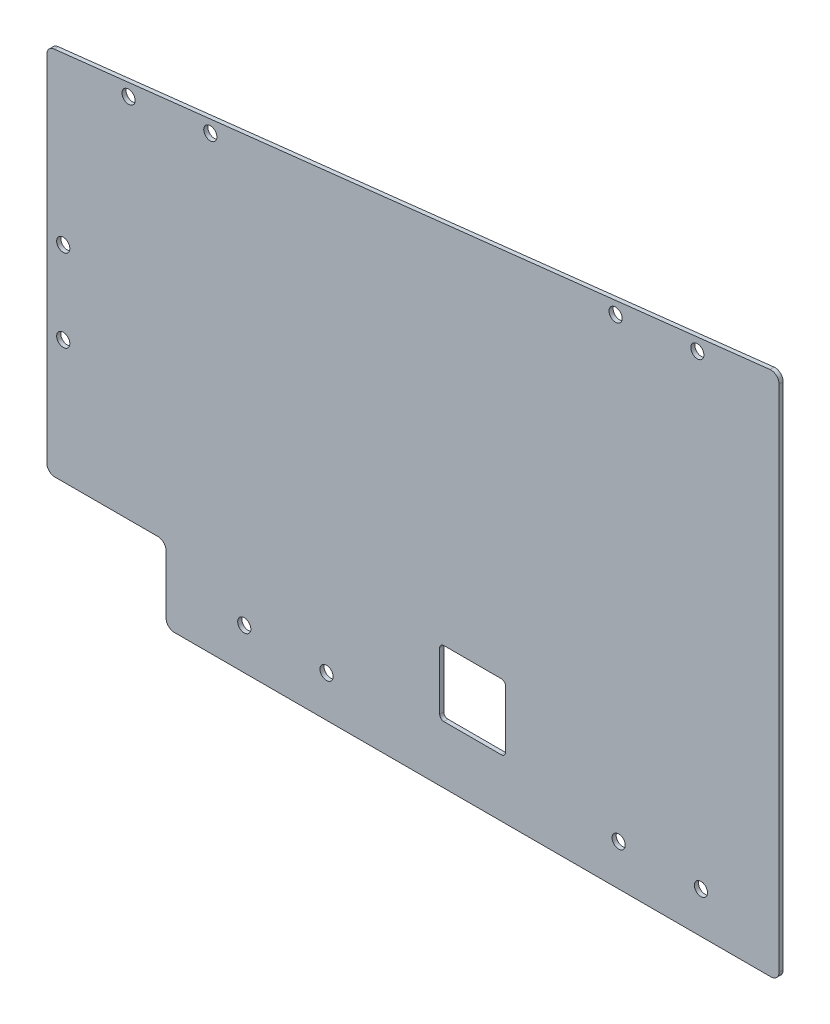
ISO-10303-21;
HEADER;
FILE_DESCRIPTION(('STEP AP214'),'2;1');
FILE_NAME('part.step','',(''),(''),'','','');
FILE_SCHEMA(('AUTOMOTIVE_DESIGN { 1 0 10303 214 1 1 1 1 }'));
ENDSEC;
DATA;
#1=APPLICATION_CONTEXT('core data for automotive mechanical design processes');
#2=APPLICATION_PROTOCOL_DEFINITION('international standard','automotive_design',2000,#1);
#3=PRODUCT_CONTEXT('',#1,'mechanical');
#4=PRODUCT('Part','Part','',(#3));
#5=PRODUCT_RELATED_PRODUCT_CATEGORY('part','',(#4));
#6=PRODUCT_DEFINITION_FORMATION('','',#4);
#7=PRODUCT_DEFINITION_CONTEXT('part definition',#1,'design');
#8=PRODUCT_DEFINITION('design','',#6,#7);
#9=PRODUCT_DEFINITION_SHAPE('','',#8);
#10=(LENGTH_UNIT() NAMED_UNIT(*) SI_UNIT(.MILLI.,.METRE.));
#11=(NAMED_UNIT(*) PLANE_ANGLE_UNIT() SI_UNIT($,.RADIAN.));
#12=(NAMED_UNIT(*) SI_UNIT($,.STERADIAN.) SOLID_ANGLE_UNIT());
#13=UNCERTAINTY_MEASURE_WITH_UNIT(LENGTH_MEASURE(1.E-05),#10,'distance_accuracy_value','');
#14=(GEOMETRIC_REPRESENTATION_CONTEXT(3) GLOBAL_UNCERTAINTY_ASSIGNED_CONTEXT((#13)) GLOBAL_UNIT_ASSIGNED_CONTEXT((#10,
#11,#12)) REPRESENTATION_CONTEXT('',''));
#15=CARTESIAN_POINT('',(0.,0.,0.));
#16=DIRECTION('',(0.,0.,1.));
#17=DIRECTION('',(1.,0.,0.));
#18=AXIS2_PLACEMENT_3D('',#15,#16,#17);
#19=CARTESIAN_POINT('',(-45.,-10.,1.));
#20=DIRECTION('',(0.,1.,0.));
#21=DIRECTION('',(0.,0.,1.));
#22=AXIS2_PLACEMENT_3D('',#19,#20,#21);
#23=PLANE('',#22);
#24=DIRECTION('',(1.,0.,0.));
#25=VECTOR('',#24,1.);
#26=CARTESIAN_POINT('',(-45.,-10.,0.));
#27=LINE('',#26,#25);
#28=CARTESIAN_POINT('',(-83.,-10.,0.));
#29=VERTEX_POINT('',#28);
#30=CARTESIAN_POINT('',(62.,-10.,0.));
#31=VERTEX_POINT('',#30);
#32=EDGE_CURVE('E178',#29,#31,#27,.T.);
#33=ORIENTED_EDGE('',*,*,#32,.T.);
#34=DIRECTION('',(0.,0.,1.));
#35=VECTOR('',#34,1.);
#36=CARTESIAN_POINT('',(62.,-10.,1.));
#37=LINE('',#36,#35);
#38=CARTESIAN_POINT('',(62.,-10.,1.));
#39=VERTEX_POINT('',#38);
#40=EDGE_CURVE('E184',#31,#39,#37,.T.);
#41=ORIENTED_EDGE('',*,*,#40,.T.);
#42=DIRECTION('',(1.,0.,0.));
#43=VECTOR('',#42,1.);
#44=CARTESIAN_POINT('',(-45.,-10.,1.));
#45=LINE('',#44,#43);
#46=CARTESIAN_POINT('',(-83.,-10.,1.));
#47=VERTEX_POINT('',#46);
#48=EDGE_CURVE('E181',#47,#39,#45,.T.);
#49=ORIENTED_EDGE('',*,*,#48,.F.);
#50=DIRECTION('',(0.,0.,1.));
#51=VECTOR('',#50,1.);
#52=CARTESIAN_POINT('',(-83.,-10.,0.));
#53=LINE('',#52,#51);
#54=EDGE_CURVE('E175',#47,#29,#53,.F.);
#55=ORIENTED_EDGE('',*,*,#54,.T.);
#56=EDGE_LOOP('',(#33,#41,#49,#55));
#57=FACE_BOUND('',#56,.T.);
#58=ADVANCED_FACE('F37',(#57),#23,.F.);
#59=CARTESIAN_POINT('',(0.,0.,1.));
#60=DIRECTION('',(0.,0.,-1.));
#61=DIRECTION('',(-1.,0.,0.));
#62=AXIS2_PLACEMENT_3D('',#59,#60,#61);
#63=PLANE('',#62);
#64=DIRECTION('',(-1.,0.,0.));
#65=VECTOR('',#64,1.);
#66=CARTESIAN_POINT('',(-18.5,20.,1.));
#67=LINE('',#66,#65);
#68=CARTESIAN_POINT('',(-3.50000000000002,20.,1.));
#69=VERTEX_POINT('',#68);
#70=CARTESIAN_POINT('',(-17.5,20.,1.));
#71=VERTEX_POINT('',#70);
#72=EDGE_CURVE('E304',#69,#71,#67,.T.);
#73=ORIENTED_EDGE('',*,*,#72,.F.);
#74=CARTESIAN_POINT('',(-3.50000000000002,19.,1.));
#75=DIRECTION('',(0.,0.,-1.));
#76=DIRECTION('',(-1.,0.,0.));
#77=AXIS2_PLACEMENT_3D('',#74,#75,#76);
#78=CIRCLE('',#77,1.);
#79=CARTESIAN_POINT('',(-2.50000000000002,19.,1.));
#80=VERTEX_POINT('',#79);
#81=EDGE_CURVE('E52',#69,#80,#78,.T.);
#82=ORIENTED_EDGE('',*,*,#81,.T.);
#83=DIRECTION('',(0.,1.,0.));
#84=VECTOR('',#83,1.);
#85=CARTESIAN_POINT('',(-2.50000000000002,4.,1.));
#86=LINE('',#85,#84);
#87=CARTESIAN_POINT('',(-2.50000000000002,5.,1.));
#88=VERTEX_POINT('',#87);
#89=EDGE_CURVE('E279',#88,#80,#86,.T.);
#90=ORIENTED_EDGE('',*,*,#89,.F.);
#91=CARTESIAN_POINT('',(-3.50000000000002,5.,1.));
#92=DIRECTION('',(0.,0.,-1.));
#93=DIRECTION('',(-1.,0.,0.));
#94=AXIS2_PLACEMENT_3D('',#91,#92,#93);
#95=CIRCLE('',#94,1.);
#96=CARTESIAN_POINT('',(-3.50000000000002,4.,1.));
#97=VERTEX_POINT('',#96);
#98=EDGE_CURVE('E45',#88,#97,#95,.T.);
#99=ORIENTED_EDGE('',*,*,#98,.T.);
#100=DIRECTION('',(1.,0.,0.));
#101=VECTOR('',#100,1.);
#102=CARTESIAN_POINT('',(-18.5,4.,1.));
#103=LINE('',#102,#101);
#104=CARTESIAN_POINT('',(-17.5,4.,1.));
#105=VERTEX_POINT('',#104);
#106=EDGE_CURVE('E278',#105,#97,#103,.T.);
#107=ORIENTED_EDGE('',*,*,#106,.F.);
#108=CARTESIAN_POINT('',(-17.5,5.,1.));
#109=DIRECTION('',(0.,0.,-1.));
#110=DIRECTION('',(-1.,0.,0.));
#111=AXIS2_PLACEMENT_3D('',#108,#109,#110);
#112=CIRCLE('',#111,1.);
#113=CARTESIAN_POINT('',(-18.5,5.,1.));
#114=VERTEX_POINT('',#113);
#115=EDGE_CURVE('E264',#105,#114,#112,.T.);
#116=ORIENTED_EDGE('',*,*,#115,.T.);
#117=DIRECTION('',(0.,-1.,0.));
#118=VECTOR('',#117,1.);
#119=CARTESIAN_POINT('',(-18.5,4.,1.));
#120=LINE('',#119,#118);
#121=CARTESIAN_POINT('',(-18.5,19.,1.));
#122=VERTEX_POINT('',#121);
#123=EDGE_CURVE('E285',#122,#114,#120,.T.);
#124=ORIENTED_EDGE('',*,*,#123,.F.);
#125=CARTESIAN_POINT('',(-17.5,19.,1.));
#126=DIRECTION('',(0.,0.,-1.));
#127=DIRECTION('',(-1.,0.,0.));
#128=AXIS2_PLACEMENT_3D('',#125,#126,#127);
#129=CIRCLE('',#128,1.);
#130=EDGE_CURVE('E268',#122,#71,#129,.T.);
#131=ORIENTED_EDGE('',*,*,#130,.T.);
#132=EDGE_LOOP('',(#73,#82,#90,#99,#107,#116,#124,#131));
#133=FACE_BOUND('',#132,.T.);
#134=CARTESIAN_POINT('',(-110.,58.1,0.999999999999999));
#135=DIRECTION('',(0.,0.,-1.));
#136=DIRECTION('',(-1.,0.,0.));
#137=AXIS2_PLACEMENT_3D('',#134,#135,#136);
#138=CIRCLE('',#137,1.60000000000001);
#139=CARTESIAN_POINT('',(-111.6,58.1,0.999999999999999));
#140=VERTEX_POINT('',#139);
#141=EDGE_CURVE('E329',#140,#140,#138,.T.);
#142=ORIENTED_EDGE('',*,*,#141,.T.);
#143=EDGE_LOOP('',(#142));
#144=FACE_BOUND('',#143,.T.);
#145=CARTESIAN_POINT('',(-110.,38.1,0.999999999999999));
#146=DIRECTION('',(0.,0.,-1.));
#147=DIRECTION('',(-1.,0.,0.));
#148=AXIS2_PLACEMENT_3D('',#145,#146,#147);
#149=CIRCLE('',#148,1.60000000000001);
#150=CARTESIAN_POINT('',(-111.6,38.1,0.999999999999999));
#151=VERTEX_POINT('',#150);
#152=EDGE_CURVE('E324',#151,#151,#149,.T.);
#153=ORIENTED_EDGE('',*,*,#152,.T.);
#154=EDGE_LOOP('',(#153));
#155=FACE_BOUND('',#154,.T.);
#156=CARTESIAN_POINT('',(-94.1250637576601,97.2142612947495,1.));
#157=DIRECTION('',(0.,0.,1.));
#158=DIRECTION('',(1.,0.,0.));
#159=AXIS2_PLACEMENT_3D('',#156,#157,#158);
#160=CIRCLE('',#159,1.60000000000001);
#161=CARTESIAN_POINT('',(-92.52506375766,97.2142612947495,1.));
#162=VERTEX_POINT('',#161);
#163=EDGE_CURVE('E333',#162,#162,#160,.T.);
#164=ORIENTED_EDGE('',*,*,#163,.F.);
#165=EDGE_LOOP('',(#164));
#166=FACE_BOUND('',#165,.T.);
#167=CARTESIAN_POINT('',(-74.2501275153201,99.4474001983832,1.));
#168=DIRECTION('',(0.,0.,1.));
#169=DIRECTION('',(1.,0.,0.));
#170=AXIS2_PLACEMENT_3D('',#167,#168,#169);
#171=CIRCLE('',#170,1.60000000000001);
#172=CARTESIAN_POINT('',(-72.6501275153201,99.4474001983832,1.));
#173=VERTEX_POINT('',#172);
#174=EDGE_CURVE('E337',#173,#173,#171,.T.);
#175=ORIENTED_EDGE('',*,*,#174,.F.);
#176=EDGE_LOOP('',(#175));
#177=FACE_BOUND('',#176,.T.);
#178=CARTESIAN_POINT('',(24.2501275153201,110.514844583848,1.));
#179=DIRECTION('',(0.,0.,1.));
#180=DIRECTION('',(1.,0.,0.));
#181=AXIS2_PLACEMENT_3D('',#178,#179,#180);
#182=CIRCLE('',#181,1.60000000000001);
#183=CARTESIAN_POINT('',(25.8501275153201,110.514844583848,1.));
#184=VERTEX_POINT('',#183);
#185=EDGE_CURVE('E340',#184,#184,#182,.T.);
#186=ORIENTED_EDGE('',*,*,#185,.F.);
#187=EDGE_LOOP('',(#186));
#188=FACE_BOUND('',#187,.T.);
#189=CARTESIAN_POINT('',(44.12506375766,112.747983487482,1.));
#190=DIRECTION('',(0.,0.,1.));
#191=DIRECTION('',(1.,0.,0.));
#192=AXIS2_PLACEMENT_3D('',#189,#190,#191);
#193=CIRCLE('',#192,1.60000000000001);
#194=CARTESIAN_POINT('',(45.7250637576601,112.747983487482,1.));
#195=VERTEX_POINT('',#194);
#196=EDGE_CURVE('E332',#195,#195,#193,.T.);
#197=ORIENTED_EDGE('',*,*,#196,.F.);
#198=EDGE_LOOP('',(#197));
#199=FACE_BOUND('',#198,.T.);
#200=CARTESIAN_POINT('',(45.,0.,1.));
#201=DIRECTION('',(0.,0.,1.));
#202=DIRECTION('',(1.,0.,0.));
#203=AXIS2_PLACEMENT_3D('',#200,#201,#202);
#204=CIRCLE('',#203,1.6);
#205=CARTESIAN_POINT('',(46.6,0.,1.));
#206=VERTEX_POINT('',#205);
#207=EDGE_CURVE('E345',#206,#206,#204,.T.);
#208=ORIENTED_EDGE('',*,*,#207,.F.);
#209=EDGE_LOOP('',(#208));
#210=FACE_BOUND('',#209,.T.);
#211=CARTESIAN_POINT('',(-46.,0.,1.));
#212=DIRECTION('',(0.,0.,1.));
#213=DIRECTION('',(1.,0.,0.));
#214=AXIS2_PLACEMENT_3D('',#211,#212,#213);
#215=CIRCLE('',#214,1.6);
#216=CARTESIAN_POINT('',(-44.4,0.,1.));
#217=VERTEX_POINT('',#216);
#218=EDGE_CURVE('E350',#217,#217,#215,.T.);
#219=ORIENTED_EDGE('',*,*,#218,.F.);
#220=EDGE_LOOP('',(#219));
#221=FACE_BOUND('',#220,.T.);
#222=CARTESIAN_POINT('',(-66.,0.,1.));
#223=DIRECTION('',(0.,0.,1.));
#224=DIRECTION('',(1.,0.,0.));
#225=AXIS2_PLACEMENT_3D('',#222,#223,#224);
#226=CIRCLE('',#225,1.60000000000001);
#227=CARTESIAN_POINT('',(-64.4,0.,1.));
#228=VERTEX_POINT('',#227);
#229=EDGE_CURVE('E353',#228,#228,#226,.T.);
#230=ORIENTED_EDGE('',*,*,#229,.F.);
#231=EDGE_LOOP('',(#230));
#232=FACE_BOUND('',#231,.T.);
#233=CARTESIAN_POINT('',(25.,0.,1.));
#234=DIRECTION('',(0.,0.,1.));
#235=DIRECTION('',(1.,0.,0.));
#236=AXIS2_PLACEMENT_3D('',#233,#234,#235);
#237=CIRCLE('',#236,1.6);
#238=CARTESIAN_POINT('',(26.6,0.,1.));
#239=VERTEX_POINT('',#238);
#240=EDGE_CURVE('E349',#239,#239,#237,.T.);
#241=ORIENTED_EDGE('',*,*,#240,.F.);
#242=EDGE_LOOP('',(#241));
#243=FACE_BOUND('',#242,.T.);
#244=ORIENTED_EDGE('',*,*,#48,.T.);
#245=CARTESIAN_POINT('',(62.,-8.,1.));
#246=DIRECTION('',(0.,0.,-1.));
#247=DIRECTION('',(-1.,0.,0.));
#248=AXIS2_PLACEMENT_3D('',#245,#246,#247);
#249=CIRCLE('',#248,2.);
#250=CARTESIAN_POINT('',(64.,-8.,1.));
#251=VERTEX_POINT('',#250);
#252=EDGE_CURVE('E417',#39,#251,#249,.F.);
#253=ORIENTED_EDGE('',*,*,#252,.T.);
#254=DIRECTION('',(0.,-1.,0.));
#255=VECTOR('',#254,1.);
#256=CARTESIAN_POINT('',(64.,0.,1.));
#257=LINE('',#256,#255);
#258=CARTESIAN_POINT('',(64.,115.762695826287,1.));
#259=VERTEX_POINT('',#258);
#260=EDGE_CURVE('E382',#259,#251,#257,.T.);
#261=ORIENTED_EDGE('',*,*,#260,.F.);
#262=CARTESIAN_POINT('',(62.,115.762695826287,1.));
#263=DIRECTION('',(0.,0.,-1.));
#264=DIRECTION('',(-1.,0.,0.));
#265=AXIS2_PLACEMENT_3D('',#262,#263,#264);
#266=CIRCLE('',#265,2.);
#267=CARTESIAN_POINT('',(61.7766861096366,117.750189450521,1.));
#268=VERTEX_POINT('',#267);
#269=EDGE_CURVE('E415',#259,#268,#266,.F.);
#270=ORIENTED_EDGE('',*,*,#269,.T.);
#271=DIRECTION('',(0.993746812116997,0.111656945181685,0.));
#272=VECTOR('',#271,1.);
#273=CARTESIAN_POINT('',(-12.295225034285,109.427502805137,1.));
#274=LINE('',#273,#272);
#275=CARTESIAN_POINT('',(-112.223313890363,98.1996276527682,1.));
#276=VERTEX_POINT('',#275);
#277=EDGE_CURVE('E363',#276,#268,#274,.T.);
#278=ORIENTED_EDGE('',*,*,#277,.F.);
#279=CARTESIAN_POINT('',(-112.,96.2121340285342,1.));
#280=DIRECTION('',(0.,0.,-1.));
#281=DIRECTION('',(-1.,0.,0.));
#282=AXIS2_PLACEMENT_3D('',#279,#280,#281);
#283=CIRCLE('',#282,2.);
#284=CARTESIAN_POINT('',(-114.,96.2121340285342,1.));
#285=VERTEX_POINT('',#284);
#286=EDGE_CURVE('E413',#276,#285,#283,.F.);
#287=ORIENTED_EDGE('',*,*,#286,.T.);
#288=DIRECTION('',(0.,1.,0.));
#289=VECTOR('',#288,1.);
#290=CARTESIAN_POINT('',(-114.,0.,1.));
#291=LINE('',#290,#289);
#292=CARTESIAN_POINT('',(-114.,10.2,1.));
#293=VERTEX_POINT('',#292);
#294=EDGE_CURVE('E372',#293,#285,#291,.T.);
#295=ORIENTED_EDGE('',*,*,#294,.F.);
#296=CARTESIAN_POINT('',(-112.,10.2,1.));
#297=DIRECTION('',(0.,0.,-1.));
#298=DIRECTION('',(-1.,0.,0.));
#299=AXIS2_PLACEMENT_3D('',#296,#297,#298);
#300=CIRCLE('',#299,2.);
#301=CARTESIAN_POINT('',(-112.,8.2,1.));
#302=VERTEX_POINT('',#301);
#303=EDGE_CURVE('E409',#293,#302,#300,.F.);
#304=ORIENTED_EDGE('',*,*,#303,.T.);
#305=DIRECTION('',(-1.,0.,0.));
#306=VECTOR('',#305,1.);
#307=CARTESIAN_POINT('',(0.,8.20000000000001,1.));
#308=LINE('',#307,#306);
#309=CARTESIAN_POINT('',(-87.,8.2,1.));
#310=VERTEX_POINT('',#309);
#311=EDGE_CURVE('E375',#310,#302,#308,.T.);
#312=ORIENTED_EDGE('',*,*,#311,.F.);
#313=CARTESIAN_POINT('',(-87.,6.2,1.));
#314=DIRECTION('',(0.,0.,-1.));
#315=DIRECTION('',(-1.,0.,0.));
#316=AXIS2_PLACEMENT_3D('',#313,#314,#315);
#317=CIRCLE('',#316,2.);
#318=CARTESIAN_POINT('',(-85.,6.2,1.));
#319=VERTEX_POINT('',#318);
#320=EDGE_CURVE('E229',#310,#319,#317,.T.);
#321=ORIENTED_EDGE('',*,*,#320,.T.);
#322=DIRECTION('',(0.,-1.,0.));
#323=VECTOR('',#322,1.);
#324=CARTESIAN_POINT('',(-85.,0.,1.));
#325=LINE('',#324,#323);
#326=CARTESIAN_POINT('',(-85.,-8.,1.));
#327=VERTEX_POINT('',#326);
#328=EDGE_CURVE('E379',#319,#327,#325,.T.);
#329=ORIENTED_EDGE('',*,*,#328,.T.);
#330=CARTESIAN_POINT('',(-83.,-8.,1.));
#331=DIRECTION('',(0.,0.,-1.));
#332=DIRECTION('',(-1.,0.,0.));
#333=AXIS2_PLACEMENT_3D('',#330,#331,#332);
#334=CIRCLE('',#333,2.);
#335=EDGE_CURVE('E411',#327,#47,#334,.F.);
#336=ORIENTED_EDGE('',*,*,#335,.T.);
#337=EDGE_LOOP('',(#244,#253,#261,#270,#278,#287,#295,#304,#312,#321,#329,#336));
#338=FACE_BOUND('',#337,.T.);
#339=ADVANCED_FACE('F276',(#133,#144,#155,#166,#177,#188,#199,#210,#221,#232,#243,#338),#63,.F.);
#340=CARTESIAN_POINT('',(0.,0.,0.));
#341=DIRECTION('',(0.,0.,-1.));
#342=DIRECTION('',(-1.,0.,0.));
#343=AXIS2_PLACEMENT_3D('',#340,#341,#342);
#344=PLANE('',#343);
#345=DIRECTION('',(0.,-1.,0.));
#346=VECTOR('',#345,1.);
#347=CARTESIAN_POINT('',(-2.50000000000002,0.,0.));
#348=LINE('',#347,#346);
#349=CARTESIAN_POINT('',(-2.50000000000002,19.,0.));
#350=VERTEX_POINT('',#349);
#351=CARTESIAN_POINT('',(-2.50000000000002,5.,0.));
#352=VERTEX_POINT('',#351);
#353=EDGE_CURVE('E242',#350,#352,#348,.T.);
#354=ORIENTED_EDGE('',*,*,#353,.F.);
#355=CARTESIAN_POINT('',(-3.50000000000002,19.,0.));
#356=DIRECTION('',(0.,0.,-1.));
#357=DIRECTION('',(-1.,0.,0.));
#358=AXIS2_PLACEMENT_3D('',#355,#356,#357);
#359=CIRCLE('',#358,1.);
#360=CARTESIAN_POINT('',(-3.50000000000002,20.,0.));
#361=VERTEX_POINT('',#360);
#362=EDGE_CURVE('E273',#350,#361,#359,.F.);
#363=ORIENTED_EDGE('',*,*,#362,.T.);
#364=DIRECTION('',(1.,0.,0.));
#365=VECTOR('',#364,1.);
#366=CARTESIAN_POINT('',(0.,20.,0.));
#367=LINE('',#366,#365);
#368=CARTESIAN_POINT('',(-17.5,20.,0.));
#369=VERTEX_POINT('',#368);
#370=EDGE_CURVE('E233',#369,#361,#367,.T.);
#371=ORIENTED_EDGE('',*,*,#370,.F.);
#372=CARTESIAN_POINT('',(-17.5,19.,0.));
#373=DIRECTION('',(0.,0.,-1.));
#374=DIRECTION('',(-1.,0.,0.));
#375=AXIS2_PLACEMENT_3D('',#372,#373,#374);
#376=CIRCLE('',#375,1.);
#377=CARTESIAN_POINT('',(-18.5,19.,0.));
#378=VERTEX_POINT('',#377);
#379=EDGE_CURVE('E270',#369,#378,#376,.F.);
#380=ORIENTED_EDGE('',*,*,#379,.T.);
#381=DIRECTION('',(0.,1.,0.));
#382=VECTOR('',#381,1.);
#383=CARTESIAN_POINT('',(-18.5,0.,0.));
#384=LINE('',#383,#382);
#385=CARTESIAN_POINT('',(-18.5,5.,0.));
#386=VERTEX_POINT('',#385);
#387=EDGE_CURVE('E236',#386,#378,#384,.T.);
#388=ORIENTED_EDGE('',*,*,#387,.F.);
#389=CARTESIAN_POINT('',(-17.5,5.,0.));
#390=DIRECTION('',(0.,0.,-1.));
#391=DIRECTION('',(-1.,0.,0.));
#392=AXIS2_PLACEMENT_3D('',#389,#390,#391);
#393=CIRCLE('',#392,1.);
#394=CARTESIAN_POINT('',(-17.5,4.,0.));
#395=VERTEX_POINT('',#394);
#396=EDGE_CURVE('E266',#386,#395,#393,.F.);
#397=ORIENTED_EDGE('',*,*,#396,.T.);
#398=DIRECTION('',(-1.,0.,0.));
#399=VECTOR('',#398,1.);
#400=CARTESIAN_POINT('',(0.,4.,0.));
#401=LINE('',#400,#399);
#402=CARTESIAN_POINT('',(-3.50000000000002,4.,0.));
#403=VERTEX_POINT('',#402);
#404=EDGE_CURVE('E239',#403,#395,#401,.T.);
#405=ORIENTED_EDGE('',*,*,#404,.F.);
#406=CARTESIAN_POINT('',(-3.50000000000002,5.,0.));
#407=DIRECTION('',(0.,0.,-1.));
#408=DIRECTION('',(-1.,0.,0.));
#409=AXIS2_PLACEMENT_3D('',#406,#407,#408);
#410=CIRCLE('',#409,1.);
#411=EDGE_CURVE('E11',#403,#352,#410,.F.);
#412=ORIENTED_EDGE('',*,*,#411,.T.);
#413=EDGE_LOOP('',(#354,#363,#371,#380,#388,#397,#405,#412));
#414=FACE_BOUND('',#413,.T.);
#415=CARTESIAN_POINT('',(-110.,58.1,0.));
#416=DIRECTION('',(0.,0.,-1.));
#417=DIRECTION('',(-1.,0.,0.));
#418=AXIS2_PLACEMENT_3D('',#415,#416,#417);
#419=CIRCLE('',#418,1.60000000000001);
#420=CARTESIAN_POINT('',(-111.6,58.1,0.));
#421=VERTEX_POINT('',#420);
#422=EDGE_CURVE('E321',#421,#421,#419,.T.);
#423=ORIENTED_EDGE('',*,*,#422,.F.);
#424=EDGE_LOOP('',(#423));
#425=FACE_BOUND('',#424,.T.);
#426=CARTESIAN_POINT('',(-110.,38.1,0.));
#427=DIRECTION('',(0.,0.,-1.));
#428=DIRECTION('',(-1.,0.,0.));
#429=AXIS2_PLACEMENT_3D('',#426,#427,#428);
#430=CIRCLE('',#429,1.60000000000001);
#431=CARTESIAN_POINT('',(-111.6,38.1,0.));
#432=VERTEX_POINT('',#431);
#433=EDGE_CURVE('E284',#432,#432,#430,.T.);
#434=ORIENTED_EDGE('',*,*,#433,.F.);
#435=EDGE_LOOP('',(#434));
#436=FACE_BOUND('',#435,.T.);
#437=CARTESIAN_POINT('',(-94.1250637576601,97.2142612947495,0.));
#438=DIRECTION('',(0.,0.,-1.));
#439=DIRECTION('',(-1.,0.,0.));
#440=AXIS2_PLACEMENT_3D('',#437,#438,#439);
#441=CIRCLE('',#440,1.60000000000001);
#442=CARTESIAN_POINT('',(-95.7250637576601,97.2142612947495,0.));
#443=VERTEX_POINT('',#442);
#444=EDGE_CURVE('E354',#443,#443,#441,.T.);
#445=ORIENTED_EDGE('',*,*,#444,.F.);
#446=EDGE_LOOP('',(#445));
#447=FACE_BOUND('',#446,.T.);
#448=CARTESIAN_POINT('',(-74.2501275153201,99.4474001983832,0.));
#449=DIRECTION('',(0.,0.,-1.));
#450=DIRECTION('',(-1.,0.,0.));
#451=AXIS2_PLACEMENT_3D('',#448,#449,#450);
#452=CIRCLE('',#451,1.60000000000001);
#453=CARTESIAN_POINT('',(-75.8501275153201,99.4474001983832,0.));
#454=VERTEX_POINT('',#453);
#455=EDGE_CURVE('E403',#454,#454,#452,.T.);
#456=ORIENTED_EDGE('',*,*,#455,.F.);
#457=EDGE_LOOP('',(#456));
#458=FACE_BOUND('',#457,.T.);
#459=CARTESIAN_POINT('',(24.2501275153201,110.514844583848,0.));
#460=DIRECTION('',(0.,0.,-1.));
#461=DIRECTION('',(-1.,0.,0.));
#462=AXIS2_PLACEMENT_3D('',#459,#460,#461);
#463=CIRCLE('',#462,1.60000000000001);
#464=CARTESIAN_POINT('',(22.6501275153201,110.514844583848,0.));
#465=VERTEX_POINT('',#464);
#466=EDGE_CURVE('E400',#465,#465,#463,.T.);
#467=ORIENTED_EDGE('',*,*,#466,.F.);
#468=EDGE_LOOP('',(#467));
#469=FACE_BOUND('',#468,.T.);
#470=CARTESIAN_POINT('',(44.12506375766,112.747983487482,0.));
#471=DIRECTION('',(0.,0.,-1.));
#472=DIRECTION('',(-1.,0.,0.));
#473=AXIS2_PLACEMENT_3D('',#470,#471,#472);
#474=CIRCLE('',#473,1.60000000000001);
#475=CARTESIAN_POINT('',(42.52506375766,112.747983487482,0.));
#476=VERTEX_POINT('',#475);
#477=EDGE_CURVE('E336',#476,#476,#474,.T.);
#478=ORIENTED_EDGE('',*,*,#477,.F.);
#479=EDGE_LOOP('',(#478));
#480=FACE_BOUND('',#479,.T.);
#481=CARTESIAN_POINT('',(45.,0.,0.));
#482=DIRECTION('',(0.,0.,-1.));
#483=DIRECTION('',(-1.,0.,0.));
#484=AXIS2_PLACEMENT_3D('',#481,#482,#483);
#485=CIRCLE('',#484,1.6);
#486=CARTESIAN_POINT('',(43.4,0.,0.));
#487=VERTEX_POINT('',#486);
#488=EDGE_CURVE('E376',#487,#487,#485,.T.);
#489=ORIENTED_EDGE('',*,*,#488,.F.);
#490=EDGE_LOOP('',(#489));
#491=FACE_BOUND('',#490,.T.);
#492=CARTESIAN_POINT('',(-46.,0.,0.));
#493=DIRECTION('',(0.,0.,-1.));
#494=DIRECTION('',(-1.,0.,0.));
#495=AXIS2_PLACEMENT_3D('',#492,#493,#494);
#496=CIRCLE('',#495,1.6);
#497=CARTESIAN_POINT('',(-47.6,0.,0.));
#498=VERTEX_POINT('',#497);
#499=EDGE_CURVE('E393',#498,#498,#496,.T.);
#500=ORIENTED_EDGE('',*,*,#499,.F.);
#501=EDGE_LOOP('',(#500));
#502=FACE_BOUND('',#501,.T.);
#503=CARTESIAN_POINT('',(-66.,0.,0.));
#504=DIRECTION('',(0.,0.,-1.));
#505=DIRECTION('',(-1.,0.,0.));
#506=AXIS2_PLACEMENT_3D('',#503,#504,#505);
#507=CIRCLE('',#506,1.60000000000001);
#508=CARTESIAN_POINT('',(-67.6,0.,0.));
#509=VERTEX_POINT('',#508);
#510=EDGE_CURVE('E390',#509,#509,#507,.T.);
#511=ORIENTED_EDGE('',*,*,#510,.F.);
#512=EDGE_LOOP('',(#511));
#513=FACE_BOUND('',#512,.T.);
#514=CARTESIAN_POINT('',(25.,0.,0.));
#515=DIRECTION('',(0.,0.,-1.));
#516=DIRECTION('',(-1.,0.,0.));
#517=AXIS2_PLACEMENT_3D('',#514,#515,#516);
#518=CIRCLE('',#517,1.6);
#519=CARTESIAN_POINT('',(23.4,0.,0.));
#520=VERTEX_POINT('',#519);
#521=EDGE_CURVE('E348',#520,#520,#518,.T.);
#522=ORIENTED_EDGE('',*,*,#521,.F.);
#523=EDGE_LOOP('',(#522));
#524=FACE_BOUND('',#523,.T.);
#525=DIRECTION('',(0.,-1.,0.));
#526=VECTOR('',#525,1.);
#527=CARTESIAN_POINT('',(64.,0.,0.));
#528=LINE('',#527,#526);
#529=CARTESIAN_POINT('',(64.,115.762695826287,0.));
#530=VERTEX_POINT('',#529);
#531=CARTESIAN_POINT('',(64.,-8.,0.));
#532=VERTEX_POINT('',#531);
#533=EDGE_CURVE('E368',#530,#532,#528,.T.);
#534=ORIENTED_EDGE('',*,*,#533,.T.);
#535=CARTESIAN_POINT('',(62.,-8.,0.));
#536=DIRECTION('',(0.,0.,-1.));
#537=DIRECTION('',(-1.,0.,0.));
#538=AXIS2_PLACEMENT_3D('',#535,#536,#537);
#539=CIRCLE('',#538,2.);
#540=EDGE_CURVE('E193',#532,#31,#539,.T.);
#541=ORIENTED_EDGE('',*,*,#540,.T.);
#542=ORIENTED_EDGE('',*,*,#32,.F.);
#543=CARTESIAN_POINT('',(-83.,-8.,0.));
#544=DIRECTION('',(0.,0.,-1.));
#545=DIRECTION('',(-1.,0.,0.));
#546=AXIS2_PLACEMENT_3D('',#543,#544,#545);
#547=CIRCLE('',#546,2.);
#548=CARTESIAN_POINT('',(-85.,-8.,0.));
#549=VERTEX_POINT('',#548);
#550=EDGE_CURVE('E190',#29,#549,#547,.T.);
#551=ORIENTED_EDGE('',*,*,#550,.T.);
#552=DIRECTION('',(0.,-1.,0.));
#553=VECTOR('',#552,1.);
#554=CARTESIAN_POINT('',(-85.,0.,0.));
#555=LINE('',#554,#553);
#556=CARTESIAN_POINT('',(-85.,6.2,0.));
#557=VERTEX_POINT('',#556);
#558=EDGE_CURVE('E366',#557,#549,#555,.T.);
#559=ORIENTED_EDGE('',*,*,#558,.F.);
#560=CARTESIAN_POINT('',(-87.,6.2,0.));
#561=DIRECTION('',(0.,0.,-1.));
#562=DIRECTION('',(-1.,0.,0.));
#563=AXIS2_PLACEMENT_3D('',#560,#561,#562);
#564=CIRCLE('',#563,2.);
#565=CARTESIAN_POINT('',(-87.,8.2,0.));
#566=VERTEX_POINT('',#565);
#567=EDGE_CURVE('E231',#557,#566,#564,.F.);
#568=ORIENTED_EDGE('',*,*,#567,.T.);
#569=DIRECTION('',(-1.,0.,0.));
#570=VECTOR('',#569,1.);
#571=CARTESIAN_POINT('',(0.,8.20000000000001,0.));
#572=LINE('',#571,#570);
#573=CARTESIAN_POINT('',(-112.,8.2,0.));
#574=VERTEX_POINT('',#573);
#575=EDGE_CURVE('E362',#566,#574,#572,.T.);
#576=ORIENTED_EDGE('',*,*,#575,.T.);
#577=CARTESIAN_POINT('',(-112.,10.2,0.));
#578=DIRECTION('',(0.,0.,-1.));
#579=DIRECTION('',(-1.,0.,0.));
#580=AXIS2_PLACEMENT_3D('',#577,#578,#579);
#581=CIRCLE('',#580,2.);
#582=CARTESIAN_POINT('',(-114.,10.2,0.));
#583=VERTEX_POINT('',#582);
#584=EDGE_CURVE('E201',#574,#583,#581,.T.);
#585=ORIENTED_EDGE('',*,*,#584,.T.);
#586=DIRECTION('',(0.,1.,0.));
#587=VECTOR('',#586,1.);
#588=CARTESIAN_POINT('',(-114.,0.,0.));
#589=LINE('',#588,#587);
#590=CARTESIAN_POINT('',(-114.,96.2121340285342,0.));
#591=VERTEX_POINT('',#590);
#592=EDGE_CURVE('E359',#583,#591,#589,.T.);
#593=ORIENTED_EDGE('',*,*,#592,.T.);
#594=CARTESIAN_POINT('',(-112.,96.2121340285342,0.));
#595=DIRECTION('',(0.,0.,-1.));
#596=DIRECTION('',(-1.,0.,0.));
#597=AXIS2_PLACEMENT_3D('',#594,#595,#596);
#598=CIRCLE('',#597,2.);
#599=CARTESIAN_POINT('',(-112.223313890363,98.1996276527682,0.));
#600=VERTEX_POINT('',#599);
#601=EDGE_CURVE('E200',#591,#600,#598,.T.);
#602=ORIENTED_EDGE('',*,*,#601,.T.);
#603=DIRECTION('',(0.993746812116997,0.111656945181685,0.));
#604=VECTOR('',#603,1.);
#605=CARTESIAN_POINT('',(-12.295225034285,109.427502805137,0.));
#606=LINE('',#605,#604);
#607=CARTESIAN_POINT('',(61.7766861096366,117.750189450521,0.));
#608=VERTEX_POINT('',#607);
#609=EDGE_CURVE('E194',#600,#608,#606,.T.);
#610=ORIENTED_EDGE('',*,*,#609,.T.);
#611=CARTESIAN_POINT('',(62.,115.762695826287,0.));
#612=DIRECTION('',(0.,0.,-1.));
#613=DIRECTION('',(-1.,0.,0.));
#614=AXIS2_PLACEMENT_3D('',#611,#612,#613);
#615=CIRCLE('',#614,2.);
#616=EDGE_CURVE('E203',#608,#530,#615,.T.);
#617=ORIENTED_EDGE('',*,*,#616,.T.);
#618=EDGE_LOOP('',(#534,#541,#542,#551,#559,#568,#576,#585,#593,#602,#610,#617));
#619=FACE_BOUND('',#618,.T.);
#620=ADVANCED_FACE('F188',(#414,#425,#436,#447,#458,#469,#480,#491,#502,#513,#524,#619),#344,.T.);
#621=CARTESIAN_POINT('',(-114.,0.,0.));
#622=DIRECTION('',(1.,0.,0.));
#623=DIRECTION('',(0.,0.,-1.));
#624=AXIS2_PLACEMENT_3D('',#621,#622,#623);
#625=PLANE('',#624);
#626=ORIENTED_EDGE('',*,*,#294,.T.);
#627=DIRECTION('',(0.,0.,1.));
#628=VECTOR('',#627,1.);
#629=CARTESIAN_POINT('',(-114.,96.2121340285342,0.));
#630=LINE('',#629,#628);
#631=EDGE_CURVE('E219',#285,#591,#630,.F.);
#632=ORIENTED_EDGE('',*,*,#631,.T.);
#633=ORIENTED_EDGE('',*,*,#592,.F.);
#634=DIRECTION('',(0.,0.,1.));
#635=VECTOR('',#634,1.);
#636=CARTESIAN_POINT('',(-114.,10.2,0.));
#637=LINE('',#636,#635);
#638=EDGE_CURVE('E216',#583,#293,#637,.T.);
#639=ORIENTED_EDGE('',*,*,#638,.T.);
#640=EDGE_LOOP('',(#626,#632,#633,#639));
#641=FACE_BOUND('',#640,.T.);
#642=ADVANCED_FACE('F451',(#641),#625,.F.);
#643=CARTESIAN_POINT('',(-12.295225034285,109.427502805137,0.));
#644=DIRECTION('',(0.111656945181685,-0.993746812116997,0.));
#645=DIRECTION('',(0.993746812116997,0.111656945181685,0.));
#646=AXIS2_PLACEMENT_3D('',#643,#644,#645);
#647=PLANE('',#646);
#648=ORIENTED_EDGE('',*,*,#277,.T.);
#649=DIRECTION('',(0.,0.,1.));
#650=VECTOR('',#649,1.);
#651=CARTESIAN_POINT('',(61.7766861096366,117.750189450521,0.));
#652=LINE('',#651,#650);
#653=EDGE_CURVE('E214',#268,#608,#652,.F.);
#654=ORIENTED_EDGE('',*,*,#653,.T.);
#655=ORIENTED_EDGE('',*,*,#609,.F.);
#656=DIRECTION('',(0.,0.,1.));
#657=VECTOR('',#656,1.);
#658=CARTESIAN_POINT('',(-112.223313890363,98.1996276527682,0.));
#659=LINE('',#658,#657);
#660=EDGE_CURVE('E211',#600,#276,#659,.T.);
#661=ORIENTED_EDGE('',*,*,#660,.T.);
#662=EDGE_LOOP('',(#648,#654,#655,#661));
#663=FACE_BOUND('',#662,.T.);
#664=ADVANCED_FACE('F460',(#663),#647,.F.);
#665=CARTESIAN_POINT('',(64.,0.,0.));
#666=DIRECTION('',(-1.,0.,0.));
#667=DIRECTION('',(0.,-1.,0.));
#668=AXIS2_PLACEMENT_3D('',#665,#666,#667);
#669=PLANE('',#668);
#670=ORIENTED_EDGE('',*,*,#260,.T.);
#671=DIRECTION('',(0.,0.,1.));
#672=VECTOR('',#671,1.);
#673=CARTESIAN_POINT('',(64.,-8.,0.));
#674=LINE('',#673,#672);
#675=EDGE_CURVE('E205',#251,#532,#674,.F.);
#676=ORIENTED_EDGE('',*,*,#675,.T.);
#677=ORIENTED_EDGE('',*,*,#533,.F.);
#678=DIRECTION('',(0.,0.,1.));
#679=VECTOR('',#678,1.);
#680=CARTESIAN_POINT('',(64.,115.762695826287,0.));
#681=LINE('',#680,#679);
#682=EDGE_CURVE('E419',#530,#259,#681,.T.);
#683=ORIENTED_EDGE('',*,*,#682,.T.);
#684=EDGE_LOOP('',(#670,#676,#677,#683));
#685=FACE_BOUND('',#684,.T.);
#686=ADVANCED_FACE('F424',(#685),#669,.F.);
#687=CARTESIAN_POINT('',(-85.,0.,0.));
#688=DIRECTION('',(-1.,0.,0.));
#689=DIRECTION('',(0.,0.,1.));
#690=AXIS2_PLACEMENT_3D('',#687,#688,#689);
#691=PLANE('',#690);
#692=ORIENTED_EDGE('',*,*,#558,.T.);
#693=DIRECTION('',(0.,0.,1.));
#694=VECTOR('',#693,1.);
#695=CARTESIAN_POINT('',(-85.,-8.,1.));
#696=LINE('',#695,#694);
#697=EDGE_CURVE('E199',#549,#327,#696,.T.);
#698=ORIENTED_EDGE('',*,*,#697,.T.);
#699=ORIENTED_EDGE('',*,*,#328,.F.);
#700=DIRECTION('',(0.,0.,1.));
#701=VECTOR('',#700,1.);
#702=CARTESIAN_POINT('',(-85.,6.2,0.));
#703=LINE('',#702,#701);
#704=EDGE_CURVE('E221',#319,#557,#703,.F.);
#705=ORIENTED_EDGE('',*,*,#704,.T.);
#706=EDGE_LOOP('',(#692,#698,#699,#705));
#707=FACE_BOUND('',#706,.T.);
#708=ADVANCED_FACE('F433',(#707),#691,.T.);
#709=CARTESIAN_POINT('',(0.,8.20000000000001,0.));
#710=DIRECTION('',(0.,1.,0.));
#711=DIRECTION('',(-1.,0.,0.));
#712=AXIS2_PLACEMENT_3D('',#709,#710,#711);
#713=PLANE('',#712);
#714=ORIENTED_EDGE('',*,*,#575,.F.);
#715=DIRECTION('',(0.,0.,1.));
#716=VECTOR('',#715,1.);
#717=CARTESIAN_POINT('',(-87.,8.2,0.));
#718=LINE('',#717,#716);
#719=EDGE_CURVE('E226',#566,#310,#718,.T.);
#720=ORIENTED_EDGE('',*,*,#719,.T.);
#721=ORIENTED_EDGE('',*,*,#311,.T.);
#722=DIRECTION('',(0.,0.,1.));
#723=VECTOR('',#722,1.);
#724=CARTESIAN_POINT('',(-112.,8.2,0.));
#725=LINE('',#724,#723);
#726=EDGE_CURVE('E224',#302,#574,#725,.F.);
#727=ORIENTED_EDGE('',*,*,#726,.T.);
#728=EDGE_LOOP('',(#714,#720,#721,#727));
#729=FACE_BOUND('',#728,.T.);
#730=ADVANCED_FACE('F442',(#729),#713,.F.);
#731=CARTESIAN_POINT('',(25.,0.,-9.));
#732=DIRECTION('',(0.,0.,1.));
#733=DIRECTION('',(1.,0.,0.));
#734=AXIS2_PLACEMENT_3D('',#731,#732,#733);
#735=CYLINDRICAL_SURFACE('',#734,1.6);
#736=ORIENTED_EDGE('',*,*,#521,.T.);
#737=EDGE_LOOP('',(#736));
#738=FACE_BOUND('',#737,.T.);
#739=ORIENTED_EDGE('',*,*,#240,.T.);
#740=EDGE_LOOP('',(#739));
#741=FACE_BOUND('',#740,.T.);
#742=ADVANCED_FACE('F487',(#738,#741),#735,.F.);
#743=CARTESIAN_POINT('',(-66.,0.,-9.));
#744=DIRECTION('',(0.,0.,1.));
#745=DIRECTION('',(1.,0.,0.));
#746=AXIS2_PLACEMENT_3D('',#743,#744,#745);
#747=CYLINDRICAL_SURFACE('',#746,1.60000000000001);
#748=ORIENTED_EDGE('',*,*,#510,.T.);
#749=EDGE_LOOP('',(#748));
#750=FACE_BOUND('',#749,.T.);
#751=ORIENTED_EDGE('',*,*,#229,.T.);
#752=EDGE_LOOP('',(#751));
#753=FACE_BOUND('',#752,.T.);
#754=ADVANCED_FACE('F494',(#750,#753),#747,.F.);
#755=CARTESIAN_POINT('',(-46.,0.,-9.));
#756=DIRECTION('',(0.,0.,1.));
#757=DIRECTION('',(1.,0.,0.));
#758=AXIS2_PLACEMENT_3D('',#755,#756,#757);
#759=CYLINDRICAL_SURFACE('',#758,1.6);
#760=ORIENTED_EDGE('',*,*,#499,.T.);
#761=EDGE_LOOP('',(#760));
#762=FACE_BOUND('',#761,.T.);
#763=ORIENTED_EDGE('',*,*,#218,.T.);
#764=EDGE_LOOP('',(#763));
#765=FACE_BOUND('',#764,.T.);
#766=ADVANCED_FACE('F497',(#762,#765),#759,.F.);
#767=CARTESIAN_POINT('',(45.,0.,-9.));
#768=DIRECTION('',(0.,0.,1.));
#769=DIRECTION('',(1.,0.,0.));
#770=AXIS2_PLACEMENT_3D('',#767,#768,#769);
#771=CYLINDRICAL_SURFACE('',#770,1.6);
#772=ORIENTED_EDGE('',*,*,#488,.T.);
#773=EDGE_LOOP('',(#772));
#774=FACE_BOUND('',#773,.T.);
#775=ORIENTED_EDGE('',*,*,#207,.T.);
#776=EDGE_LOOP('',(#775));
#777=FACE_BOUND('',#776,.T.);
#778=ADVANCED_FACE('F504',(#774,#777),#771,.F.);
#779=CARTESIAN_POINT('',(44.12506375766,112.747983487482,-9.));
#780=DIRECTION('',(0.,0.,1.));
#781=DIRECTION('',(1.,0.,0.));
#782=AXIS2_PLACEMENT_3D('',#779,#780,#781);
#783=CYLINDRICAL_SURFACE('',#782,1.60000000000001);
#784=ORIENTED_EDGE('',*,*,#477,.T.);
#785=EDGE_LOOP('',(#784));
#786=FACE_BOUND('',#785,.T.);
#787=ORIENTED_EDGE('',*,*,#196,.T.);
#788=EDGE_LOOP('',(#787));
#789=FACE_BOUND('',#788,.T.);
#790=ADVANCED_FACE('F508',(#786,#789),#783,.F.);
#791=CARTESIAN_POINT('',(24.2501275153201,110.514844583848,-9.));
#792=DIRECTION('',(0.,0.,1.));
#793=DIRECTION('',(1.,0.,0.));
#794=AXIS2_PLACEMENT_3D('',#791,#792,#793);
#795=CYLINDRICAL_SURFACE('',#794,1.60000000000001);
#796=ORIENTED_EDGE('',*,*,#466,.T.);
#797=EDGE_LOOP('',(#796));
#798=FACE_BOUND('',#797,.T.);
#799=ORIENTED_EDGE('',*,*,#185,.T.);
#800=EDGE_LOOP('',(#799));
#801=FACE_BOUND('',#800,.T.);
#802=ADVANCED_FACE('F512',(#798,#801),#795,.F.);
#803=CARTESIAN_POINT('',(-74.2501275153201,99.4474001983832,-9.));
#804=DIRECTION('',(0.,0.,1.));
#805=DIRECTION('',(1.,0.,0.));
#806=AXIS2_PLACEMENT_3D('',#803,#804,#805);
#807=CYLINDRICAL_SURFACE('',#806,1.60000000000001);
#808=ORIENTED_EDGE('',*,*,#455,.T.);
#809=EDGE_LOOP('',(#808));
#810=FACE_BOUND('',#809,.T.);
#811=ORIENTED_EDGE('',*,*,#174,.T.);
#812=EDGE_LOOP('',(#811));
#813=FACE_BOUND('',#812,.T.);
#814=ADVANCED_FACE('F516',(#810,#813),#807,.F.);
#815=CARTESIAN_POINT('',(-94.1250637576601,97.2142612947495,-9.));
#816=DIRECTION('',(0.,0.,1.));
#817=DIRECTION('',(1.,0.,0.));
#818=AXIS2_PLACEMENT_3D('',#815,#816,#817);
#819=CYLINDRICAL_SURFACE('',#818,1.60000000000001);
#820=ORIENTED_EDGE('',*,*,#444,.T.);
#821=EDGE_LOOP('',(#820));
#822=FACE_BOUND('',#821,.T.);
#823=ORIENTED_EDGE('',*,*,#163,.T.);
#824=EDGE_LOOP('',(#823));
#825=FACE_BOUND('',#824,.T.);
#826=ADVANCED_FACE('F520',(#822,#825),#819,.F.);
#827=CARTESIAN_POINT('',(-110.,38.1,10.));
#828=DIRECTION('',(0.,0.,-1.));
#829=DIRECTION('',(-1.,0.,0.));
#830=AXIS2_PLACEMENT_3D('',#827,#828,#829);
#831=CYLINDRICAL_SURFACE('',#830,1.60000000000001);
#832=ORIENTED_EDGE('',*,*,#433,.T.);
#833=EDGE_LOOP('',(#832));
#834=FACE_BOUND('',#833,.T.);
#835=ORIENTED_EDGE('',*,*,#152,.F.);
#836=EDGE_LOOP('',(#835));
#837=FACE_BOUND('',#836,.T.);
#838=ADVANCED_FACE('F524',(#834,#837),#831,.F.);
#839=CARTESIAN_POINT('',(-110.,58.1,10.));
#840=DIRECTION('',(0.,0.,-1.));
#841=DIRECTION('',(-1.,0.,0.));
#842=AXIS2_PLACEMENT_3D('',#839,#840,#841);
#843=CYLINDRICAL_SURFACE('',#842,1.60000000000001);
#844=ORIENTED_EDGE('',*,*,#422,.T.);
#845=EDGE_LOOP('',(#844));
#846=FACE_BOUND('',#845,.T.);
#847=ORIENTED_EDGE('',*,*,#141,.F.);
#848=EDGE_LOOP('',(#847));
#849=FACE_BOUND('',#848,.T.);
#850=ADVANCED_FACE('F471',(#846,#849),#843,.F.);
#851=CARTESIAN_POINT('',(62.,-8.,1.));
#852=DIRECTION('',(0.,0.,1.));
#853=DIRECTION('',(1.,0.,0.));
#854=AXIS2_PLACEMENT_3D('',#851,#852,#853);
#855=CYLINDRICAL_SURFACE('',#854,2.);
#856=ORIENTED_EDGE('',*,*,#540,.F.);
#857=ORIENTED_EDGE('',*,*,#675,.F.);
#858=ORIENTED_EDGE('',*,*,#252,.F.);
#859=ORIENTED_EDGE('',*,*,#40,.F.);
#860=EDGE_LOOP('',(#856,#857,#858,#859));
#861=FACE_BOUND('',#860,.T.);
#862=ADVANCED_FACE('F429',(#861),#855,.T.);
#863=CARTESIAN_POINT('',(62.,115.762695826287,0.));
#864=DIRECTION('',(0.,0.,1.));
#865=DIRECTION('',(1.,0.,0.));
#866=AXIS2_PLACEMENT_3D('',#863,#864,#865);
#867=CYLINDRICAL_SURFACE('',#866,2.);
#868=ORIENTED_EDGE('',*,*,#616,.F.);
#869=ORIENTED_EDGE('',*,*,#653,.F.);
#870=ORIENTED_EDGE('',*,*,#269,.F.);
#871=ORIENTED_EDGE('',*,*,#682,.F.);
#872=EDGE_LOOP('',(#868,#869,#870,#871));
#873=FACE_BOUND('',#872,.T.);
#874=ADVANCED_FACE('F463',(#873),#867,.T.);
#875=CARTESIAN_POINT('',(-112.,96.2121340285342,0.));
#876=DIRECTION('',(0.,0.,1.));
#877=DIRECTION('',(1.,0.,0.));
#878=AXIS2_PLACEMENT_3D('',#875,#876,#877);
#879=CYLINDRICAL_SURFACE('',#878,2.);
#880=ORIENTED_EDGE('',*,*,#601,.F.);
#881=ORIENTED_EDGE('',*,*,#631,.F.);
#882=ORIENTED_EDGE('',*,*,#286,.F.);
#883=ORIENTED_EDGE('',*,*,#660,.F.);
#884=EDGE_LOOP('',(#880,#881,#882,#883));
#885=FACE_BOUND('',#884,.T.);
#886=ADVANCED_FACE('F457',(#885),#879,.T.);
#887=CARTESIAN_POINT('',(-83.,-8.,0.));
#888=DIRECTION('',(0.,0.,-1.));
#889=DIRECTION('',(-1.,0.,0.));
#890=AXIS2_PLACEMENT_3D('',#887,#888,#889);
#891=CYLINDRICAL_SURFACE('',#890,2.);
#892=ORIENTED_EDGE('',*,*,#550,.F.);
#893=ORIENTED_EDGE('',*,*,#54,.F.);
#894=ORIENTED_EDGE('',*,*,#335,.F.);
#895=ORIENTED_EDGE('',*,*,#697,.F.);
#896=EDGE_LOOP('',(#892,#893,#894,#895));
#897=FACE_BOUND('',#896,.T.);
#898=ADVANCED_FACE('F197',(#897),#891,.T.);
#899=CARTESIAN_POINT('',(-87.,6.2,0.));
#900=DIRECTION('',(0.,0.,1.));
#901=DIRECTION('',(1.,0.,0.));
#902=AXIS2_PLACEMENT_3D('',#899,#900,#901);
#903=CYLINDRICAL_SURFACE('',#902,2.);
#904=ORIENTED_EDGE('',*,*,#567,.F.);
#905=ORIENTED_EDGE('',*,*,#704,.F.);
#906=ORIENTED_EDGE('',*,*,#320,.F.);
#907=ORIENTED_EDGE('',*,*,#719,.F.);
#908=EDGE_LOOP('',(#904,#905,#906,#907));
#909=FACE_BOUND('',#908,.T.);
#910=ADVANCED_FACE('F439',(#909),#903,.F.);
#911=CARTESIAN_POINT('',(-112.,10.2,0.));
#912=DIRECTION('',(0.,0.,1.));
#913=DIRECTION('',(1.,0.,0.));
#914=AXIS2_PLACEMENT_3D('',#911,#912,#913);
#915=CYLINDRICAL_SURFACE('',#914,2.);
#916=ORIENTED_EDGE('',*,*,#584,.F.);
#917=ORIENTED_EDGE('',*,*,#726,.F.);
#918=ORIENTED_EDGE('',*,*,#303,.F.);
#919=ORIENTED_EDGE('',*,*,#638,.F.);
#920=EDGE_LOOP('',(#916,#917,#918,#919));
#921=FACE_BOUND('',#920,.T.);
#922=ADVANCED_FACE('F448',(#921),#915,.T.);
#923=CARTESIAN_POINT('',(-2.50000000000002,4.,-9.));
#924=DIRECTION('',(1.,0.,0.));
#925=DIRECTION('',(0.,0.,-1.));
#926=AXIS2_PLACEMENT_3D('',#923,#924,#925);
#927=PLANE('',#926);
#928=ORIENTED_EDGE('',*,*,#89,.T.);
#929=DIRECTION('',(0.,0.,1.));
#930=VECTOR('',#929,1.);
#931=CARTESIAN_POINT('',(-2.50000000000002,19.,0.));
#932=LINE('',#931,#930);
#933=EDGE_CURVE('E262',#80,#350,#932,.F.);
#934=ORIENTED_EDGE('',*,*,#933,.T.);
#935=ORIENTED_EDGE('',*,*,#353,.T.);
#936=DIRECTION('',(0.,0.,1.));
#937=VECTOR('',#936,1.);
#938=CARTESIAN_POINT('',(-2.50000000000002,5.,1.));
#939=LINE('',#938,#937);
#940=EDGE_CURVE('E260',#352,#88,#939,.T.);
#941=ORIENTED_EDGE('',*,*,#940,.T.);
#942=EDGE_LOOP('',(#928,#934,#935,#941));
#943=FACE_BOUND('',#942,.T.);
#944=ADVANCED_FACE('F293',(#943),#927,.F.);
#945=CARTESIAN_POINT('',(-18.5,4.,-9.));
#946=DIRECTION('',(0.,-1.,0.));
#947=DIRECTION('',(0.,0.,-1.));
#948=AXIS2_PLACEMENT_3D('',#945,#946,#947);
#949=PLANE('',#948);
#950=ORIENTED_EDGE('',*,*,#404,.T.);
#951=DIRECTION('',(0.,0.,1.));
#952=VECTOR('',#951,1.);
#953=CARTESIAN_POINT('',(-17.5,4.,1.));
#954=LINE('',#953,#952);
#955=EDGE_CURVE('E247',#395,#105,#954,.T.);
#956=ORIENTED_EDGE('',*,*,#955,.T.);
#957=ORIENTED_EDGE('',*,*,#106,.T.);
#958=DIRECTION('',(0.,0.,1.));
#959=VECTOR('',#958,1.);
#960=CARTESIAN_POINT('',(-3.50000000000002,4.,0.));
#961=LINE('',#960,#959);
#962=EDGE_CURVE('E245',#97,#403,#961,.F.);
#963=ORIENTED_EDGE('',*,*,#962,.T.);
#964=EDGE_LOOP('',(#950,#956,#957,#963));
#965=FACE_BOUND('',#964,.T.);
#966=ADVANCED_FACE('F281',(#965),#949,.F.);
#967=CARTESIAN_POINT('',(-18.5,4.,-9.));
#968=DIRECTION('',(-1.,0.,0.));
#969=DIRECTION('',(0.,0.,1.));
#970=AXIS2_PLACEMENT_3D('',#967,#968,#969);
#971=PLANE('',#970);
#972=ORIENTED_EDGE('',*,*,#123,.T.);
#973=DIRECTION('',(0.,0.,1.));
#974=VECTOR('',#973,1.);
#975=CARTESIAN_POINT('',(-18.5,5.,0.));
#976=LINE('',#975,#974);
#977=EDGE_CURVE('E253',#114,#386,#976,.F.);
#978=ORIENTED_EDGE('',*,*,#977,.T.);
#979=ORIENTED_EDGE('',*,*,#387,.T.);
#980=DIRECTION('',(0.,0.,1.));
#981=VECTOR('',#980,1.);
#982=CARTESIAN_POINT('',(-18.5,19.,1.));
#983=LINE('',#982,#981);
#984=EDGE_CURVE('E250',#378,#122,#983,.T.);
#985=ORIENTED_EDGE('',*,*,#984,.T.);
#986=EDGE_LOOP('',(#972,#978,#979,#985));
#987=FACE_BOUND('',#986,.T.);
#988=ADVANCED_FACE('F312',(#987),#971,.F.);
#989=CARTESIAN_POINT('',(-18.5,20.,-9.));
#990=DIRECTION('',(0.,1.,0.));
#991=DIRECTION('',(0.,0.,1.));
#992=AXIS2_PLACEMENT_3D('',#989,#990,#991);
#993=PLANE('',#992);
#994=ORIENTED_EDGE('',*,*,#72,.T.);
#995=DIRECTION('',(0.,0.,1.));
#996=VECTOR('',#995,1.);
#997=CARTESIAN_POINT('',(-17.5,20.,0.));
#998=LINE('',#997,#996);
#999=EDGE_CURVE('E258',#71,#369,#998,.F.);
#1000=ORIENTED_EDGE('',*,*,#999,.T.);
#1001=ORIENTED_EDGE('',*,*,#370,.T.);
#1002=DIRECTION('',(0.,0.,1.));
#1003=VECTOR('',#1002,1.);
#1004=CARTESIAN_POINT('',(-3.50000000000002,20.,1.));
#1005=LINE('',#1004,#1003);
#1006=EDGE_CURVE('E255',#361,#69,#1005,.T.);
#1007=ORIENTED_EDGE('',*,*,#1006,.T.);
#1008=EDGE_LOOP('',(#994,#1000,#1001,#1007));
#1009=FACE_BOUND('',#1008,.T.);
#1010=ADVANCED_FACE('F302',(#1009),#993,.F.);
#1011=CARTESIAN_POINT('',(-17.5,5.,-9.));
#1012=DIRECTION('',(0.,0.,-1.));
#1013=DIRECTION('',(-1.,0.,0.));
#1014=AXIS2_PLACEMENT_3D('',#1011,#1012,#1013);
#1015=CYLINDRICAL_SURFACE('',#1014,1.);
#1016=ORIENTED_EDGE('',*,*,#396,.F.);
#1017=ORIENTED_EDGE('',*,*,#977,.F.);
#1018=ORIENTED_EDGE('',*,*,#115,.F.);
#1019=ORIENTED_EDGE('',*,*,#955,.F.);
#1020=EDGE_LOOP('',(#1016,#1017,#1018,#1019));
#1021=FACE_BOUND('',#1020,.T.);
#1022=ADVANCED_FACE('F316',(#1021),#1015,.F.);
#1023=CARTESIAN_POINT('',(-17.5,19.,-9.));
#1024=DIRECTION('',(0.,0.,-1.));
#1025=DIRECTION('',(-1.,0.,0.));
#1026=AXIS2_PLACEMENT_3D('',#1023,#1024,#1025);
#1027=CYLINDRICAL_SURFACE('',#1026,1.);
#1028=ORIENTED_EDGE('',*,*,#379,.F.);
#1029=ORIENTED_EDGE('',*,*,#999,.F.);
#1030=ORIENTED_EDGE('',*,*,#130,.F.);
#1031=ORIENTED_EDGE('',*,*,#984,.F.);
#1032=EDGE_LOOP('',(#1028,#1029,#1030,#1031));
#1033=FACE_BOUND('',#1032,.T.);
#1034=ADVANCED_FACE('F306',(#1033),#1027,.F.);
#1035=CARTESIAN_POINT('',(-3.50000000000002,19.,-9.));
#1036=DIRECTION('',(0.,0.,-1.));
#1037=DIRECTION('',(-1.,0.,0.));
#1038=AXIS2_PLACEMENT_3D('',#1035,#1036,#1037);
#1039=CYLINDRICAL_SURFACE('',#1038,1.);
#1040=ORIENTED_EDGE('',*,*,#362,.F.);
#1041=ORIENTED_EDGE('',*,*,#933,.F.);
#1042=ORIENTED_EDGE('',*,*,#81,.F.);
#1043=ORIENTED_EDGE('',*,*,#1006,.F.);
#1044=EDGE_LOOP('',(#1040,#1041,#1042,#1043));
#1045=FACE_BOUND('',#1044,.T.);
#1046=ADVANCED_FACE('F296',(#1045),#1039,.F.);
#1047=CARTESIAN_POINT('',(-3.50000000000002,5.,-9.));
#1048=DIRECTION('',(0.,0.,-1.));
#1049=DIRECTION('',(-1.,0.,0.));
#1050=AXIS2_PLACEMENT_3D('',#1047,#1048,#1049);
#1051=CYLINDRICAL_SURFACE('',#1050,1.);
#1052=ORIENTED_EDGE('',*,*,#411,.F.);
#1053=ORIENTED_EDGE('',*,*,#962,.F.);
#1054=ORIENTED_EDGE('',*,*,#98,.F.);
#1055=ORIENTED_EDGE('',*,*,#940,.F.);
#1056=EDGE_LOOP('',(#1052,#1053,#1054,#1055));
#1057=FACE_BOUND('',#1056,.T.);
#1058=ADVANCED_FACE('F39',(#1057),#1051,.F.);
#1059=CLOSED_SHELL('',(#58,#339,#620,#642,#664,#686,#708,#730,#742,#754,#766,#778,#790,#802,
#814,#826,#838,#850,#862,#874,#886,#898,#910,#922,#944,#966,#988,#1010,#1022,#1034,#1046,#1058));
#1060=MANIFOLD_SOLID_BREP('B2',#1059);
#1061=ADVANCED_BREP_SHAPE_REPRESENTATION('',(#18,#1060),#14);
#1062=SHAPE_DEFINITION_REPRESENTATION(#9,#1061);
ENDSEC;
END-ISO-10303-21;
